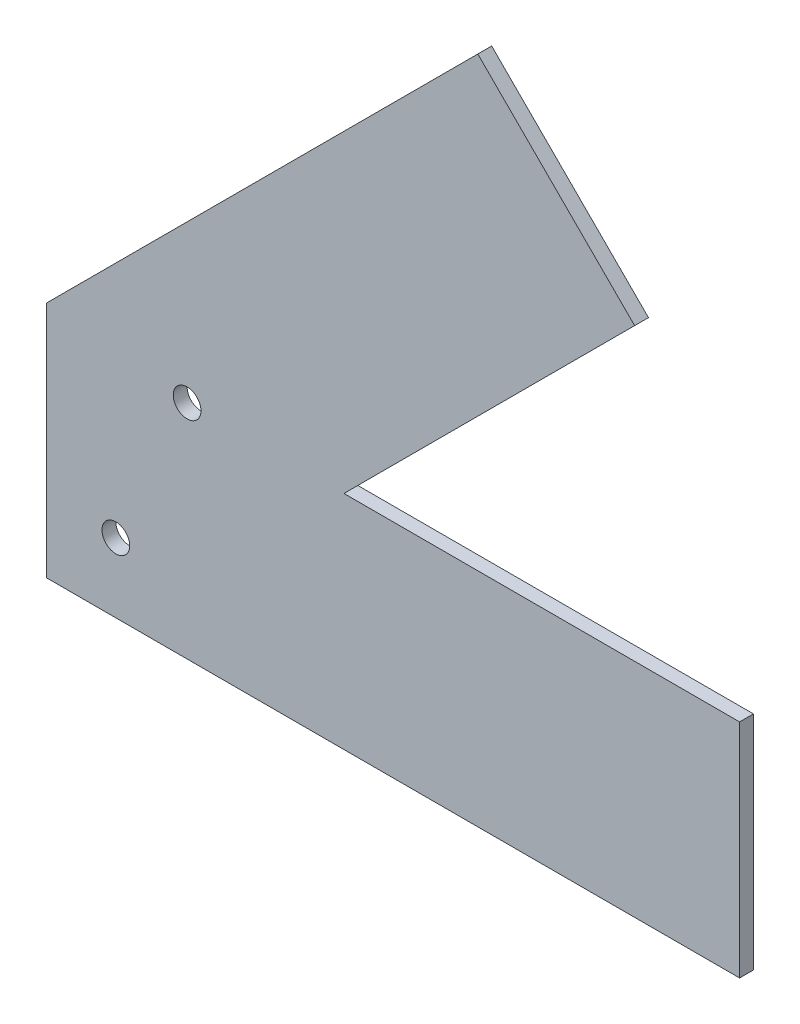
ISO-10303-21;
HEADER;
FILE_DESCRIPTION(('STEP AP214'),'2;1');
FILE_NAME('part.step','',(''),(''),'','','');
FILE_SCHEMA(('AUTOMOTIVE_DESIGN { 1 0 10303 214 1 1 1 1 }'));
ENDSEC;
DATA;
#1=APPLICATION_CONTEXT('core data for automotive mechanical design processes');
#2=APPLICATION_PROTOCOL_DEFINITION('international standard','automotive_design',2000,#1);
#3=PRODUCT_CONTEXT('',#1,'mechanical');
#4=PRODUCT('Part','Part','',(#3));
#5=PRODUCT_RELATED_PRODUCT_CATEGORY('part','',(#4));
#6=PRODUCT_DEFINITION_FORMATION('','',#4);
#7=PRODUCT_DEFINITION_CONTEXT('part definition',#1,'design');
#8=PRODUCT_DEFINITION('design','',#6,#7);
#9=PRODUCT_DEFINITION_SHAPE('','',#8);
#10=(LENGTH_UNIT() NAMED_UNIT(*) SI_UNIT(.MILLI.,.METRE.));
#11=(NAMED_UNIT(*) PLANE_ANGLE_UNIT() SI_UNIT($,.RADIAN.));
#12=(NAMED_UNIT(*) SI_UNIT($,.STERADIAN.) SOLID_ANGLE_UNIT());
#13=UNCERTAINTY_MEASURE_WITH_UNIT(LENGTH_MEASURE(1.E-05),#10,'distance_accuracy_value','');
#14=(GEOMETRIC_REPRESENTATION_CONTEXT(3) GLOBAL_UNCERTAINTY_ASSIGNED_CONTEXT((#13)) GLOBAL_UNIT_ASSIGNED_CONTEXT((#10,
#11,#12)) REPRESENTATION_CONTEXT('',''));
#15=CARTESIAN_POINT('',(0.,0.,0.));
#16=DIRECTION('',(0.,0.,1.));
#17=DIRECTION('',(1.,0.,0.));
#18=AXIS2_PLACEMENT_3D('',#15,#16,#17);
#19=CARTESIAN_POINT('',(260.,10.,5.));
#20=DIRECTION('',(0.,1.,0.));
#21=DIRECTION('',(-1.,0.,0.));
#22=AXIS2_PLACEMENT_3D('',#19,#20,#21);
#23=PLANE('',#22);
#24=DIRECTION('',(1.,0.,0.));
#25=VECTOR('',#24,1.);
#26=CARTESIAN_POINT('',(260.,10.,0.));
#27=LINE('',#26,#25);
#28=CARTESIAN_POINT('',(10.,10.,0.));
#29=VERTEX_POINT('',#28);
#30=CARTESIAN_POINT('',(260.,10.,0.));
#31=VERTEX_POINT('',#30);
#32=EDGE_CURVE('E122',#29,#31,#27,.T.);
#33=ORIENTED_EDGE('',*,*,#32,.T.);
#34=DIRECTION('',(0.,0.,-1.));
#35=VECTOR('',#34,1.);
#36=CARTESIAN_POINT('',(260.,10.,5.));
#37=LINE('',#36,#35);
#38=CARTESIAN_POINT('',(260.,10.,5.));
#39=VERTEX_POINT('',#38);
#40=EDGE_CURVE('E11',#39,#31,#37,.T.);
#41=ORIENTED_EDGE('',*,*,#40,.F.);
#42=DIRECTION('',(1.,0.,0.));
#43=VECTOR('',#42,1.);
#44=CARTESIAN_POINT('',(260.,10.,5.));
#45=LINE('',#44,#43);
#46=CARTESIAN_POINT('',(10.,10.,5.));
#47=VERTEX_POINT('',#46);
#48=EDGE_CURVE('E135',#47,#39,#45,.T.);
#49=ORIENTED_EDGE('',*,*,#48,.F.);
#50=DIRECTION('',(0.,0.,-1.));
#51=VECTOR('',#50,1.);
#52=CARTESIAN_POINT('',(10.,10.,5.));
#53=LINE('',#52,#51);
#54=EDGE_CURVE('E118',#47,#29,#53,.T.);
#55=ORIENTED_EDGE('',*,*,#54,.T.);
#56=EDGE_LOOP('',(#33,#41,#49,#55));
#57=FACE_BOUND('',#56,.T.);
#58=ADVANCED_FACE('F32',(#57),#23,.F.);
#59=CARTESIAN_POINT('',(260.,90.,5.));
#60=DIRECTION('',(-1.,0.,0.));
#61=DIRECTION('',(0.,0.,1.));
#62=AXIS2_PLACEMENT_3D('',#59,#60,#61);
#63=PLANE('',#62);
#64=DIRECTION('',(0.,1.,0.));
#65=VECTOR('',#64,1.);
#66=CARTESIAN_POINT('',(260.,90.,0.));
#67=LINE('',#66,#65);
#68=CARTESIAN_POINT('',(260.,90.,0.));
#69=VERTEX_POINT('',#68);
#70=EDGE_CURVE('E125',#31,#69,#67,.T.);
#71=ORIENTED_EDGE('',*,*,#70,.T.);
#72=DIRECTION('',(0.,0.,-1.));
#73=VECTOR('',#72,1.);
#74=CARTESIAN_POINT('',(260.,90.,5.));
#75=LINE('',#74,#73);
#76=CARTESIAN_POINT('',(260.,90.,5.));
#77=VERTEX_POINT('',#76);
#78=EDGE_CURVE('E40',#77,#69,#75,.T.);
#79=ORIENTED_EDGE('',*,*,#78,.F.);
#80=DIRECTION('',(0.,1.,0.));
#81=VECTOR('',#80,1.);
#82=CARTESIAN_POINT('',(260.,90.,5.));
#83=LINE('',#82,#81);
#84=EDGE_CURVE('E88',#39,#77,#83,.T.);
#85=ORIENTED_EDGE('',*,*,#84,.F.);
#86=ORIENTED_EDGE('',*,*,#40,.T.);
#87=EDGE_LOOP('',(#71,#79,#85,#86));
#88=FACE_BOUND('',#87,.T.);
#89=ADVANCED_FACE('F194',(#88),#63,.F.);
#90=CARTESIAN_POINT('',(117.28,90.,5.));
#91=DIRECTION('',(0.,-1.,0.));
#92=DIRECTION('',(0.,0.,-1.));
#93=AXIS2_PLACEMENT_3D('',#90,#91,#92);
#94=PLANE('',#93);
#95=DIRECTION('',(-1.,0.,0.));
#96=VECTOR('',#95,1.);
#97=CARTESIAN_POINT('',(117.28,90.,0.));
#98=LINE('',#97,#96);
#99=CARTESIAN_POINT('',(117.28,90.,0.));
#100=VERTEX_POINT('',#99);
#101=EDGE_CURVE('E128',#69,#100,#98,.T.);
#102=ORIENTED_EDGE('',*,*,#101,.T.);
#103=DIRECTION('',(0.,0.,-1.));
#104=VECTOR('',#103,1.);
#105=CARTESIAN_POINT('',(117.28,90.,5.));
#106=LINE('',#105,#104);
#107=CARTESIAN_POINT('',(117.28,90.,5.));
#108=VERTEX_POINT('',#107);
#109=EDGE_CURVE('E139',#108,#100,#106,.T.);
#110=ORIENTED_EDGE('',*,*,#109,.F.);
#111=DIRECTION('',(-1.,0.,0.));
#112=VECTOR('',#111,1.);
#113=CARTESIAN_POINT('',(117.28,90.,5.));
#114=LINE('',#113,#112);
#115=EDGE_CURVE('E147',#77,#108,#114,.T.);
#116=ORIENTED_EDGE('',*,*,#115,.F.);
#117=ORIENTED_EDGE('',*,*,#78,.T.);
#118=EDGE_LOOP('',(#102,#110,#116,#117));
#119=FACE_BOUND('',#118,.T.);
#120=ADVANCED_FACE('F145',(#119),#94,.F.);
#121=CARTESIAN_POINT('',(222.132034355965,194.852034355964,5.));
#122=DIRECTION('',(-0.707106781186544,0.707106781186551,0.));
#123=DIRECTION('',(-0.707106781186551,-0.707106781186544,0.));
#124=AXIS2_PLACEMENT_3D('',#121,#122,#123);
#125=PLANE('',#124);
#126=DIRECTION('',(0.707106781186551,0.707106781186544,0.));
#127=VECTOR('',#126,1.);
#128=CARTESIAN_POINT('',(222.132034355965,194.852034355964,0.));
#129=LINE('',#128,#127);
#130=CARTESIAN_POINT('',(222.132034355965,194.852034355964,0.));
#131=VERTEX_POINT('',#130);
#132=EDGE_CURVE('E130',#100,#131,#129,.T.);
#133=ORIENTED_EDGE('',*,*,#132,.T.);
#134=DIRECTION('',(0.,0.,-1.));
#135=VECTOR('',#134,1.);
#136=CARTESIAN_POINT('',(222.132034355965,194.852034355964,5.));
#137=LINE('',#136,#135);
#138=CARTESIAN_POINT('',(222.132034355965,194.852034355964,5.));
#139=VERTEX_POINT('',#138);
#140=EDGE_CURVE('E113',#139,#131,#137,.T.);
#141=ORIENTED_EDGE('',*,*,#140,.F.);
#142=DIRECTION('',(0.707106781186551,0.707106781186544,0.));
#143=VECTOR('',#142,1.);
#144=CARTESIAN_POINT('',(222.132034355965,194.852034355964,5.));
#145=LINE('',#144,#143);
#146=EDGE_CURVE('E104',#108,#139,#145,.T.);
#147=ORIENTED_EDGE('',*,*,#146,.F.);
#148=ORIENTED_EDGE('',*,*,#109,.T.);
#149=EDGE_LOOP('',(#133,#141,#147,#148));
#150=FACE_BOUND('',#149,.T.);
#151=ADVANCED_FACE('F153',(#150),#125,.F.);
#152=CARTESIAN_POINT('',(165.563491861042,251.420576850888,5.));
#153=DIRECTION('',(-0.707106781186551,-0.707106781186544,0.));
#154=DIRECTION('',(0.707106781186544,-0.707106781186551,0.));
#155=AXIS2_PLACEMENT_3D('',#152,#153,#154);
#156=PLANE('',#155);
#157=DIRECTION('',(-0.707106781186544,0.707106781186551,0.));
#158=VECTOR('',#157,1.);
#159=CARTESIAN_POINT('',(165.563491861042,251.420576850888,0.));
#160=LINE('',#159,#158);
#161=CARTESIAN_POINT('',(165.563491861042,251.420576850888,0.));
#162=VERTEX_POINT('',#161);
#163=EDGE_CURVE('E112',#131,#162,#160,.T.);
#164=ORIENTED_EDGE('',*,*,#163,.T.);
#165=DIRECTION('',(0.,0.,-1.));
#166=VECTOR('',#165,1.);
#167=CARTESIAN_POINT('',(165.563491861042,251.420576850888,5.));
#168=LINE('',#167,#166);
#169=CARTESIAN_POINT('',(165.563491861042,251.420576850888,5.));
#170=VERTEX_POINT('',#169);
#171=EDGE_CURVE('E109',#170,#162,#168,.T.);
#172=ORIENTED_EDGE('',*,*,#171,.F.);
#173=DIRECTION('',(-0.707106781186544,0.707106781186551,0.));
#174=VECTOR('',#173,1.);
#175=CARTESIAN_POINT('',(165.563491861042,251.420576850888,5.));
#176=LINE('',#175,#174);
#177=EDGE_CURVE('E98',#139,#170,#176,.T.);
#178=ORIENTED_EDGE('',*,*,#177,.F.);
#179=ORIENTED_EDGE('',*,*,#140,.T.);
#180=EDGE_LOOP('',(#164,#172,#178,#179));
#181=FACE_BOUND('',#180,.T.);
#182=ADVANCED_FACE('F110',(#181),#156,.F.);
#183=CARTESIAN_POINT('',(10.0000000000014,95.8570849898473,5.));
#184=DIRECTION('',(0.707106781186549,-0.707106781186546,0.));
#185=DIRECTION('',(0.707106781186546,0.707106781186549,0.));
#186=AXIS2_PLACEMENT_3D('',#183,#184,#185);
#187=PLANE('',#186);
#188=DIRECTION('',(-0.707106781186546,-0.707106781186549,0.));
#189=VECTOR('',#188,1.);
#190=CARTESIAN_POINT('',(10.0000000000014,95.8570849898473,0.));
#191=LINE('',#190,#189);
#192=CARTESIAN_POINT('',(10.0000000000014,95.8570849898473,0.));
#193=VERTEX_POINT('',#192);
#194=EDGE_CURVE('E74',#162,#193,#191,.T.);
#195=ORIENTED_EDGE('',*,*,#194,.T.);
#196=DIRECTION('',(0.,0.,-1.));
#197=VECTOR('',#196,1.);
#198=CARTESIAN_POINT('',(10.0000000000014,95.8570849898473,5.));
#199=LINE('',#198,#197);
#200=CARTESIAN_POINT('',(10.0000000000014,95.8570849898473,5.));
#201=VERTEX_POINT('',#200);
#202=EDGE_CURVE('E114',#201,#193,#199,.T.);
#203=ORIENTED_EDGE('',*,*,#202,.F.);
#204=DIRECTION('',(-0.707106781186546,-0.707106781186549,0.));
#205=VECTOR('',#204,1.);
#206=CARTESIAN_POINT('',(10.0000000000014,95.8570849898473,5.));
#207=LINE('',#206,#205);
#208=EDGE_CURVE('E102',#170,#201,#207,.T.);
#209=ORIENTED_EDGE('',*,*,#208,.F.);
#210=ORIENTED_EDGE('',*,*,#171,.T.);
#211=EDGE_LOOP('',(#195,#203,#209,#210));
#212=FACE_BOUND('',#211,.T.);
#213=ADVANCED_FACE('F116',(#212),#187,.F.);
#214=CARTESIAN_POINT('',(10.,10.,5.));
#215=DIRECTION('',(1.,0.,0.));
#216=DIRECTION('',(0.,1.,0.));
#217=AXIS2_PLACEMENT_3D('',#214,#215,#216);
#218=PLANE('',#217);
#219=DIRECTION('',(0.,-1.,0.));
#220=VECTOR('',#219,1.);
#221=CARTESIAN_POINT('',(10.,10.,0.));
#222=LINE('',#221,#220);
#223=EDGE_CURVE('E80',#193,#29,#222,.T.);
#224=ORIENTED_EDGE('',*,*,#223,.T.);
#225=ORIENTED_EDGE('',*,*,#54,.F.);
#226=DIRECTION('',(0.,-1.,0.));
#227=VECTOR('',#226,1.);
#228=CARTESIAN_POINT('',(10.,10.,5.));
#229=LINE('',#228,#227);
#230=EDGE_CURVE('E48',#201,#47,#229,.T.);
#231=ORIENTED_EDGE('',*,*,#230,.F.);
#232=ORIENTED_EDGE('',*,*,#202,.T.);
#233=EDGE_LOOP('',(#224,#225,#231,#232));
#234=FACE_BOUND('',#233,.T.);
#235=ADVANCED_FACE('F181',(#234),#218,.F.);
#236=CARTESIAN_POINT('',(0.,0.,5.));
#237=DIRECTION('',(0.,0.,-1.));
#238=DIRECTION('',(-1.,0.,0.));
#239=AXIS2_PLACEMENT_3D('',#236,#237,#238);
#240=PLANE('',#239);
#241=CARTESIAN_POINT('',(35.0000000000014,35.,5.));
#242=DIRECTION('',(0.,0.,1.));
#243=DIRECTION('',(1.,0.,0.));
#244=AXIS2_PLACEMENT_3D('',#241,#242,#243);
#245=CIRCLE('',#244,5.);
#246=CARTESIAN_POINT('',(40.0000000000014,35.,5.));
#247=VERTEX_POINT('',#246);
#248=EDGE_CURVE('E164',#247,#247,#245,.T.);
#249=ORIENTED_EDGE('',*,*,#248,.F.);
#250=EDGE_LOOP('',(#249));
#251=FACE_BOUND('',#250,.T.);
#252=CARTESIAN_POINT('',(60.7106812,90.,5.));
#253=DIRECTION('',(0.,0.,1.));
#254=DIRECTION('',(1.,0.,0.));
#255=AXIS2_PLACEMENT_3D('',#252,#253,#254);
#256=CIRCLE('',#255,5.00000000000001);
#257=CARTESIAN_POINT('',(65.7106812,90.,5.));
#258=VERTEX_POINT('',#257);
#259=EDGE_CURVE('E158',#258,#258,#256,.T.);
#260=ORIENTED_EDGE('',*,*,#259,.F.);
#261=EDGE_LOOP('',(#260));
#262=FACE_BOUND('',#261,.T.);
#263=ORIENTED_EDGE('',*,*,#48,.T.);
#264=ORIENTED_EDGE('',*,*,#84,.T.);
#265=ORIENTED_EDGE('',*,*,#115,.T.);
#266=ORIENTED_EDGE('',*,*,#146,.T.);
#267=ORIENTED_EDGE('',*,*,#177,.T.);
#268=ORIENTED_EDGE('',*,*,#208,.T.);
#269=ORIENTED_EDGE('',*,*,#230,.T.);
#270=EDGE_LOOP('',(#263,#264,#265,#266,#267,#268,#269));
#271=FACE_BOUND('',#270,.T.);
#272=ADVANCED_FACE('F100',(#251,#262,#271),#240,.F.);
#273=CARTESIAN_POINT('',(0.,0.,0.));
#274=DIRECTION('',(0.,0.,-1.));
#275=DIRECTION('',(-1.,0.,0.));
#276=AXIS2_PLACEMENT_3D('',#273,#274,#275);
#277=PLANE('',#276);
#278=CARTESIAN_POINT('',(35.0000000000014,35.,0.));
#279=DIRECTION('',(0.,0.,1.));
#280=DIRECTION('',(1.,0.,0.));
#281=AXIS2_PLACEMENT_3D('',#278,#279,#280);
#282=CIRCLE('',#281,5.);
#283=CARTESIAN_POINT('',(40.0000000000014,35.,0.));
#284=VERTEX_POINT('',#283);
#285=EDGE_CURVE('E161',#284,#284,#282,.T.);
#286=ORIENTED_EDGE('',*,*,#285,.T.);
#287=EDGE_LOOP('',(#286));
#288=FACE_BOUND('',#287,.T.);
#289=CARTESIAN_POINT('',(60.7106812,90.,0.));
#290=DIRECTION('',(0.,0.,1.));
#291=DIRECTION('',(1.,0.,0.));
#292=AXIS2_PLACEMENT_3D('',#289,#290,#291);
#293=CIRCLE('',#292,5.00000000000001);
#294=CARTESIAN_POINT('',(65.7106812,90.,0.));
#295=VERTEX_POINT('',#294);
#296=EDGE_CURVE('E126',#295,#295,#293,.T.);
#297=ORIENTED_EDGE('',*,*,#296,.T.);
#298=EDGE_LOOP('',(#297));
#299=FACE_BOUND('',#298,.T.);
#300=ORIENTED_EDGE('',*,*,#32,.F.);
#301=ORIENTED_EDGE('',*,*,#223,.F.);
#302=ORIENTED_EDGE('',*,*,#194,.F.);
#303=ORIENTED_EDGE('',*,*,#163,.F.);
#304=ORIENTED_EDGE('',*,*,#132,.F.);
#305=ORIENTED_EDGE('',*,*,#101,.F.);
#306=ORIENTED_EDGE('',*,*,#70,.F.);
#307=EDGE_LOOP('',(#300,#301,#302,#303,#304,#305,#306));
#308=FACE_BOUND('',#307,.T.);
#309=ADVANCED_FACE('F151',(#288,#299,#308),#277,.T.);
#310=CARTESIAN_POINT('',(60.7106812,90.,0.));
#311=DIRECTION('',(0.,0.,1.));
#312=DIRECTION('',(1.,0.,0.));
#313=AXIS2_PLACEMENT_3D('',#310,#311,#312);
#314=CYLINDRICAL_SURFACE('',#313,5.00000000000001);
#315=ORIENTED_EDGE('',*,*,#296,.F.);
#316=EDGE_LOOP('',(#315));
#317=FACE_BOUND('',#316,.T.);
#318=ORIENTED_EDGE('',*,*,#259,.T.);
#319=EDGE_LOOP('',(#318));
#320=FACE_BOUND('',#319,.T.);
#321=ADVANCED_FACE('F175',(#317,#320),#314,.F.);
#322=CARTESIAN_POINT('',(35.0000000000014,35.,0.));
#323=DIRECTION('',(0.,0.,1.));
#324=DIRECTION('',(1.,0.,0.));
#325=AXIS2_PLACEMENT_3D('',#322,#323,#324);
#326=CYLINDRICAL_SURFACE('',#325,5.);
#327=ORIENTED_EDGE('',*,*,#285,.F.);
#328=EDGE_LOOP('',(#327));
#329=FACE_BOUND('',#328,.T.);
#330=ORIENTED_EDGE('',*,*,#248,.T.);
#331=EDGE_LOOP('',(#330));
#332=FACE_BOUND('',#331,.T.);
#333=ADVANCED_FACE('F172',(#329,#332),#326,.F.);
#334=CLOSED_SHELL('',(#58,#89,#120,#151,#182,#213,#235,#272,#309,#321,#333));
#335=MANIFOLD_SOLID_BREP('B2',#334);
#336=ADVANCED_BREP_SHAPE_REPRESENTATION('',(#18,#335),#14);
#337=SHAPE_DEFINITION_REPRESENTATION(#9,#336);
ENDSEC;
END-ISO-10303-21;
